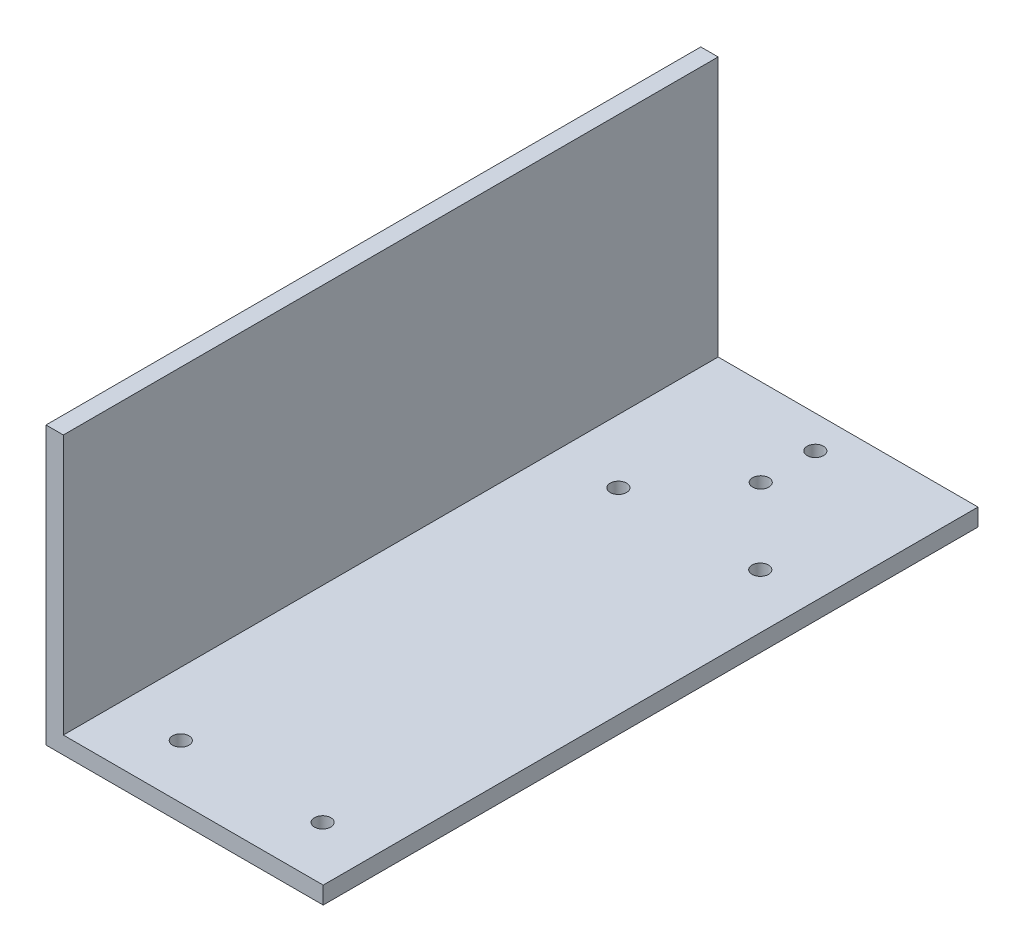
ISO-10303-21;
HEADER;
FILE_DESCRIPTION(('STEP AP214'),'2;1');
FILE_NAME('part.step','',(''),(''),'','','');
FILE_SCHEMA(('AUTOMOTIVE_DESIGN { 1 0 10303 214 1 1 1 1 }'));
ENDSEC;
DATA;
#1=APPLICATION_CONTEXT('core data for automotive mechanical design processes');
#2=APPLICATION_PROTOCOL_DEFINITION('international standard','automotive_design',2000,#1);
#3=PRODUCT_CONTEXT('',#1,'mechanical');
#4=PRODUCT('Part','Part','',(#3));
#5=PRODUCT_RELATED_PRODUCT_CATEGORY('part','',(#4));
#6=PRODUCT_DEFINITION_FORMATION('','',#4);
#7=PRODUCT_DEFINITION_CONTEXT('part definition',#1,'design');
#8=PRODUCT_DEFINITION('design','',#6,#7);
#9=PRODUCT_DEFINITION_SHAPE('','',#8);
#10=(LENGTH_UNIT() NAMED_UNIT(*) SI_UNIT(.MILLI.,.METRE.));
#11=(NAMED_UNIT(*) PLANE_ANGLE_UNIT() SI_UNIT($,.RADIAN.));
#12=(NAMED_UNIT(*) SI_UNIT($,.STERADIAN.) SOLID_ANGLE_UNIT());
#13=UNCERTAINTY_MEASURE_WITH_UNIT(LENGTH_MEASURE(1.E-05),#10,'distance_accuracy_value','');
#14=(GEOMETRIC_REPRESENTATION_CONTEXT(3) GLOBAL_UNCERTAINTY_ASSIGNED_CONTEXT((#13)) GLOBAL_UNIT_ASSIGNED_CONTEXT((#10,
#11,#12)) REPRESENTATION_CONTEXT('',''));
#15=CARTESIAN_POINT('',(0.,0.,0.));
#16=DIRECTION('',(0.,0.,1.));
#17=DIRECTION('',(1.,0.,0.));
#18=AXIS2_PLACEMENT_3D('',#15,#16,#17);
#19=CARTESIAN_POINT('',(0.,0.,120.));
#20=DIRECTION('',(1.,0.,0.));
#21=DIRECTION('',(0.,0.,-1.));
#22=AXIS2_PLACEMENT_3D('',#19,#20,#21);
#23=PLANE('',#22);
#24=DIRECTION('',(0.,-1.,0.));
#25=VECTOR('',#24,1.);
#26=CARTESIAN_POINT('',(0.,0.,0.));
#27=LINE('',#26,#25);
#28=CARTESIAN_POINT('',(0.,50.8,0.));
#29=VERTEX_POINT('',#28);
#30=CARTESIAN_POINT('',(0.,0.,0.));
#31=VERTEX_POINT('',#30);
#32=EDGE_CURVE('E132',#29,#31,#27,.T.);
#33=ORIENTED_EDGE('',*,*,#32,.T.);
#34=DIRECTION('',(0.,0.,-1.));
#35=VECTOR('',#34,1.);
#36=CARTESIAN_POINT('',(0.,0.,120.));
#37=LINE('',#36,#35);
#38=CARTESIAN_POINT('',(0.,0.,120.));
#39=VERTEX_POINT('',#38);
#40=EDGE_CURVE('E11',#39,#31,#37,.T.);
#41=ORIENTED_EDGE('',*,*,#40,.F.);
#42=DIRECTION('',(0.,-1.,0.));
#43=VECTOR('',#42,1.);
#44=CARTESIAN_POINT('',(0.,0.,120.));
#45=LINE('',#44,#43);
#46=CARTESIAN_POINT('',(0.,50.8,120.));
#47=VERTEX_POINT('',#46);
#48=EDGE_CURVE('E149',#47,#39,#45,.T.);
#49=ORIENTED_EDGE('',*,*,#48,.F.);
#50=DIRECTION('',(0.,0.,-1.));
#51=VECTOR('',#50,1.);
#52=CARTESIAN_POINT('',(0.,50.8,120.));
#53=LINE('',#52,#51);
#54=EDGE_CURVE('E128',#47,#29,#53,.T.);
#55=ORIENTED_EDGE('',*,*,#54,.T.);
#56=EDGE_LOOP('',(#33,#41,#49,#55));
#57=FACE_BOUND('',#56,.T.);
#58=ADVANCED_FACE('F43',(#57),#23,.F.);
#59=CARTESIAN_POINT('',(0.,0.,120.));
#60=DIRECTION('',(0.,1.,0.));
#61=DIRECTION('',(0.,0.,1.));
#62=AXIS2_PLACEMENT_3D('',#59,#60,#61);
#63=PLANE('',#62);
#64=CARTESIAN_POINT('',(26.985,0.,6.));
#65=DIRECTION('',(0.,1.,0.));
#66=DIRECTION('',(0.,0.,1.));
#67=AXIS2_PLACEMENT_3D('',#64,#65,#66);
#68=CIRCLE('',#67,1.5);
#69=CARTESIAN_POINT('',(26.985,0.,7.5));
#70=VERTEX_POINT('',#69);
#71=EDGE_CURVE('E376',#70,#70,#68,.T.);
#72=ORIENTED_EDGE('',*,*,#71,.T.);
#73=EDGE_LOOP('',(#72));
#74=FACE_BOUND('',#73,.T.);
#75=CARTESIAN_POINT('',(26.985,0.,16.));
#76=DIRECTION('',(0.,1.,0.));
#77=DIRECTION('',(0.,0.,1.));
#78=AXIS2_PLACEMENT_3D('',#75,#76,#77);
#79=CIRCLE('',#78,1.5);
#80=CARTESIAN_POINT('',(26.985,0.,17.5));
#81=VERTEX_POINT('',#80);
#82=EDGE_CURVE('E378',#81,#81,#79,.T.);
#83=ORIENTED_EDGE('',*,*,#82,.T.);
#84=EDGE_LOOP('',(#83));
#85=FACE_BOUND('',#84,.T.);
#86=CARTESIAN_POINT('',(40.8,0.,29.9));
#87=DIRECTION('',(0.,1.,0.));
#88=DIRECTION('',(0.,0.,1.));
#89=AXIS2_PLACEMENT_3D('',#86,#87,#88);
#90=CIRCLE('',#89,1.5);
#91=CARTESIAN_POINT('',(40.8,0.,31.4));
#92=VERTEX_POINT('',#91);
#93=EDGE_CURVE('E137',#92,#92,#90,.T.);
#94=ORIENTED_EDGE('',*,*,#93,.T.);
#95=EDGE_LOOP('',(#94));
#96=FACE_BOUND('',#95,.T.);
#97=CARTESIAN_POINT('',(14.8,0.,110.1));
#98=DIRECTION('',(0.,1.,0.));
#99=DIRECTION('',(0.,0.,1.));
#100=AXIS2_PLACEMENT_3D('',#97,#98,#99);
#101=CIRCLE('',#100,1.5);
#102=CARTESIAN_POINT('',(14.8,0.,111.6));
#103=VERTEX_POINT('',#102);
#104=EDGE_CURVE('E231',#103,#103,#101,.T.);
#105=ORIENTED_EDGE('',*,*,#104,.T.);
#106=EDGE_LOOP('',(#105));
#107=FACE_BOUND('',#106,.T.);
#108=CARTESIAN_POINT('',(40.8,0.,110.1));
#109=DIRECTION('',(0.,1.,0.));
#110=DIRECTION('',(0.,0.,1.));
#111=AXIS2_PLACEMENT_3D('',#108,#109,#110);
#112=CIRCLE('',#111,1.5);
#113=CARTESIAN_POINT('',(40.8,0.,111.6));
#114=VERTEX_POINT('',#113);
#115=EDGE_CURVE('E223',#114,#114,#112,.T.);
#116=ORIENTED_EDGE('',*,*,#115,.T.);
#117=EDGE_LOOP('',(#116));
#118=FACE_BOUND('',#117,.T.);
#119=CARTESIAN_POINT('',(14.8,0.,29.9));
#120=DIRECTION('',(0.,1.,0.));
#121=DIRECTION('',(0.,0.,1.));
#122=AXIS2_PLACEMENT_3D('',#119,#120,#121);
#123=CIRCLE('',#122,1.5);
#124=CARTESIAN_POINT('',(14.8,0.,31.4));
#125=VERTEX_POINT('',#124);
#126=EDGE_CURVE('E218',#125,#125,#123,.T.);
#127=ORIENTED_EDGE('',*,*,#126,.T.);
#128=EDGE_LOOP('',(#127));
#129=FACE_BOUND('',#128,.T.);
#130=DIRECTION('',(1.,0.,0.));
#131=VECTOR('',#130,1.);
#132=CARTESIAN_POINT('',(0.,0.,0.));
#133=LINE('',#132,#131);
#134=CARTESIAN_POINT('',(50.8,0.,0.));
#135=VERTEX_POINT('',#134);
#136=EDGE_CURVE('E136',#31,#135,#133,.T.);
#137=ORIENTED_EDGE('',*,*,#136,.T.);
#138=DIRECTION('',(0.,0.,-1.));
#139=VECTOR('',#138,1.);
#140=CARTESIAN_POINT('',(50.8,0.,120.));
#141=LINE('',#140,#139);
#142=CARTESIAN_POINT('',(50.8,0.,120.));
#143=VERTEX_POINT('',#142);
#144=EDGE_CURVE('E52',#143,#135,#141,.T.);
#145=ORIENTED_EDGE('',*,*,#144,.F.);
#146=DIRECTION('',(1.,0.,0.));
#147=VECTOR('',#146,1.);
#148=CARTESIAN_POINT('',(0.,0.,120.));
#149=LINE('',#148,#147);
#150=EDGE_CURVE('E97',#39,#143,#149,.T.);
#151=ORIENTED_EDGE('',*,*,#150,.F.);
#152=ORIENTED_EDGE('',*,*,#40,.T.);
#153=EDGE_LOOP('',(#137,#145,#151,#152));
#154=FACE_BOUND('',#153,.T.);
#155=ADVANCED_FACE('F177',(#74,#85,#96,#107,#118,#129,#154),#63,.F.);
#156=CARTESIAN_POINT('',(50.8,0.,120.));
#157=DIRECTION('',(-1.,0.,0.));
#158=DIRECTION('',(0.,-1.,0.));
#159=AXIS2_PLACEMENT_3D('',#156,#157,#158);
#160=PLANE('',#159);
#161=DIRECTION('',(0.,1.,0.));
#162=VECTOR('',#161,1.);
#163=CARTESIAN_POINT('',(50.8,0.,0.));
#164=LINE('',#163,#162);
#165=CARTESIAN_POINT('',(50.8,3.175,0.));
#166=VERTEX_POINT('',#165);
#167=EDGE_CURVE('E140',#135,#166,#164,.T.);
#168=ORIENTED_EDGE('',*,*,#167,.T.);
#169=DIRECTION('',(0.,0.,-1.));
#170=VECTOR('',#169,1.);
#171=CARTESIAN_POINT('',(50.8,3.175,120.));
#172=LINE('',#171,#170);
#173=CARTESIAN_POINT('',(50.8,3.175,120.));
#174=VERTEX_POINT('',#173);
#175=EDGE_CURVE('E121',#174,#166,#172,.T.);
#176=ORIENTED_EDGE('',*,*,#175,.F.);
#177=DIRECTION('',(0.,1.,0.));
#178=VECTOR('',#177,1.);
#179=CARTESIAN_POINT('',(50.8,0.,120.));
#180=LINE('',#179,#178);
#181=EDGE_CURVE('E110',#143,#174,#180,.T.);
#182=ORIENTED_EDGE('',*,*,#181,.F.);
#183=ORIENTED_EDGE('',*,*,#144,.T.);
#184=EDGE_LOOP('',(#168,#176,#182,#183));
#185=FACE_BOUND('',#184,.T.);
#186=ADVANCED_FACE('F159',(#185),#160,.F.);
#187=CARTESIAN_POINT('',(50.8,3.175,120.));
#188=DIRECTION('',(0.,-1.,0.));
#189=DIRECTION('',(1.,0.,0.));
#190=AXIS2_PLACEMENT_3D('',#187,#188,#189);
#191=PLANE('',#190);
#192=CARTESIAN_POINT('',(26.985,3.175,6.));
#193=DIRECTION('',(0.,1.,0.));
#194=DIRECTION('',(-1.,0.,0.));
#195=AXIS2_PLACEMENT_3D('',#192,#193,#194);
#196=CIRCLE('',#195,1.5);
#197=CARTESIAN_POINT('',(25.485,3.175,6.));
#198=VERTEX_POINT('',#197);
#199=EDGE_CURVE('E196',#198,#198,#196,.T.);
#200=ORIENTED_EDGE('',*,*,#199,.F.);
#201=EDGE_LOOP('',(#200));
#202=FACE_BOUND('',#201,.T.);
#203=CARTESIAN_POINT('',(26.985,3.175,16.));
#204=DIRECTION('',(0.,1.,0.));
#205=DIRECTION('',(-1.,0.,0.));
#206=AXIS2_PLACEMENT_3D('',#203,#204,#205);
#207=CIRCLE('',#206,1.5);
#208=CARTESIAN_POINT('',(25.485,3.175,16.));
#209=VERTEX_POINT('',#208);
#210=EDGE_CURVE('E200',#209,#209,#207,.T.);
#211=ORIENTED_EDGE('',*,*,#210,.F.);
#212=EDGE_LOOP('',(#211));
#213=FACE_BOUND('',#212,.T.);
#214=CARTESIAN_POINT('',(40.8,3.175,29.9));
#215=DIRECTION('',(0.,1.,0.));
#216=DIRECTION('',(-1.,0.,0.));
#217=AXIS2_PLACEMENT_3D('',#214,#215,#216);
#218=CIRCLE('',#217,1.5);
#219=CARTESIAN_POINT('',(39.3,3.175,29.9));
#220=VERTEX_POINT('',#219);
#221=EDGE_CURVE('E204',#220,#220,#218,.T.);
#222=ORIENTED_EDGE('',*,*,#221,.F.);
#223=EDGE_LOOP('',(#222));
#224=FACE_BOUND('',#223,.T.);
#225=CARTESIAN_POINT('',(14.8,3.175,110.1));
#226=DIRECTION('',(0.,1.,0.));
#227=DIRECTION('',(-1.,0.,0.));
#228=AXIS2_PLACEMENT_3D('',#225,#226,#227);
#229=CIRCLE('',#228,1.5);
#230=CARTESIAN_POINT('',(13.3,3.175,110.1));
#231=VERTEX_POINT('',#230);
#232=EDGE_CURVE('E208',#231,#231,#229,.T.);
#233=ORIENTED_EDGE('',*,*,#232,.F.);
#234=EDGE_LOOP('',(#233));
#235=FACE_BOUND('',#234,.T.);
#236=CARTESIAN_POINT('',(40.8,3.175,110.1));
#237=DIRECTION('',(0.,1.,0.));
#238=DIRECTION('',(-1.,0.,0.));
#239=AXIS2_PLACEMENT_3D('',#236,#237,#238);
#240=CIRCLE('',#239,1.5);
#241=CARTESIAN_POINT('',(39.3,3.175,110.1));
#242=VERTEX_POINT('',#241);
#243=EDGE_CURVE('E212',#242,#242,#240,.T.);
#244=ORIENTED_EDGE('',*,*,#243,.F.);
#245=EDGE_LOOP('',(#244));
#246=FACE_BOUND('',#245,.T.);
#247=CARTESIAN_POINT('',(14.8,3.175,29.9));
#248=DIRECTION('',(0.,1.,0.));
#249=DIRECTION('',(-1.,0.,0.));
#250=AXIS2_PLACEMENT_3D('',#247,#248,#249);
#251=CIRCLE('',#250,1.5);
#252=CARTESIAN_POINT('',(13.3,3.175,29.9));
#253=VERTEX_POINT('',#252);
#254=EDGE_CURVE('E215',#253,#253,#251,.T.);
#255=ORIENTED_EDGE('',*,*,#254,.F.);
#256=EDGE_LOOP('',(#255));
#257=FACE_BOUND('',#256,.T.);
#258=DIRECTION('',(-1.,0.,0.));
#259=VECTOR('',#258,1.);
#260=CARTESIAN_POINT('',(50.8,3.175,0.));
#261=LINE('',#260,#259);
#262=CARTESIAN_POINT('',(3.175,3.17499999999999,0.));
#263=VERTEX_POINT('',#262);
#264=EDGE_CURVE('E119',#166,#263,#261,.T.);
#265=ORIENTED_EDGE('',*,*,#264,.T.);
#266=DIRECTION('',(0.,0.,-1.));
#267=VECTOR('',#266,1.);
#268=CARTESIAN_POINT('',(3.175,3.17499999999999,120.));
#269=LINE('',#268,#267);
#270=CARTESIAN_POINT('',(3.175,3.17499999999999,120.));
#271=VERTEX_POINT('',#270);
#272=EDGE_CURVE('E116',#271,#263,#269,.T.);
#273=ORIENTED_EDGE('',*,*,#272,.F.);
#274=DIRECTION('',(-1.,0.,0.));
#275=VECTOR('',#274,1.);
#276=CARTESIAN_POINT('',(50.8,3.175,120.));
#277=LINE('',#276,#275);
#278=EDGE_CURVE('E104',#174,#271,#277,.T.);
#279=ORIENTED_EDGE('',*,*,#278,.F.);
#280=ORIENTED_EDGE('',*,*,#175,.T.);
#281=EDGE_LOOP('',(#265,#273,#279,#280));
#282=FACE_BOUND('',#281,.T.);
#283=ADVANCED_FACE('F117',(#202,#213,#224,#235,#246,#257,#282),#191,.F.);
#284=CARTESIAN_POINT('',(3.175,50.8,120.));
#285=DIRECTION('',(-1.,0.,0.));
#286=DIRECTION('',(0.,-1.,0.));
#287=AXIS2_PLACEMENT_3D('',#284,#285,#286);
#288=PLANE('',#287);
#289=DIRECTION('',(0.,1.,0.));
#290=VECTOR('',#289,1.);
#291=CARTESIAN_POINT('',(3.175,50.8,0.));
#292=LINE('',#291,#290);
#293=CARTESIAN_POINT('',(3.175,50.8,0.));
#294=VERTEX_POINT('',#293);
#295=EDGE_CURVE('E83',#263,#294,#292,.T.);
#296=ORIENTED_EDGE('',*,*,#295,.T.);
#297=DIRECTION('',(0.,0.,-1.));
#298=VECTOR('',#297,1.);
#299=CARTESIAN_POINT('',(3.175,50.8,120.));
#300=LINE('',#299,#298);
#301=CARTESIAN_POINT('',(3.175,50.8,120.));
#302=VERTEX_POINT('',#301);
#303=EDGE_CURVE('E122',#302,#294,#300,.T.);
#304=ORIENTED_EDGE('',*,*,#303,.F.);
#305=DIRECTION('',(0.,1.,0.));
#306=VECTOR('',#305,1.);
#307=CARTESIAN_POINT('',(3.175,50.8,120.));
#308=LINE('',#307,#306);
#309=EDGE_CURVE('E108',#271,#302,#308,.T.);
#310=ORIENTED_EDGE('',*,*,#309,.F.);
#311=ORIENTED_EDGE('',*,*,#272,.T.);
#312=EDGE_LOOP('',(#296,#304,#310,#311));
#313=FACE_BOUND('',#312,.T.);
#314=ADVANCED_FACE('F124',(#313),#288,.F.);
#315=CARTESIAN_POINT('',(0.,50.8,120.));
#316=DIRECTION('',(0.,-1.,0.));
#317=DIRECTION('',(1.,0.,0.));
#318=AXIS2_PLACEMENT_3D('',#315,#316,#317);
#319=PLANE('',#318);
#320=DIRECTION('',(-1.,0.,0.));
#321=VECTOR('',#320,1.);
#322=CARTESIAN_POINT('',(0.,50.8,0.));
#323=LINE('',#322,#321);
#324=EDGE_CURVE('E89',#294,#29,#323,.T.);
#325=ORIENTED_EDGE('',*,*,#324,.T.);
#326=ORIENTED_EDGE('',*,*,#54,.F.);
#327=DIRECTION('',(-1.,0.,0.));
#328=VECTOR('',#327,1.);
#329=CARTESIAN_POINT('',(0.,50.8,120.));
#330=LINE('',#329,#328);
#331=EDGE_CURVE('E60',#302,#47,#330,.T.);
#332=ORIENTED_EDGE('',*,*,#331,.F.);
#333=ORIENTED_EDGE('',*,*,#303,.T.);
#334=EDGE_LOOP('',(#325,#326,#332,#333));
#335=FACE_BOUND('',#334,.T.);
#336=ADVANCED_FACE('F166',(#335),#319,.F.);
#337=CARTESIAN_POINT('',(0.,0.,120.));
#338=DIRECTION('',(0.,0.,-1.));
#339=DIRECTION('',(-1.,0.,0.));
#340=AXIS2_PLACEMENT_3D('',#337,#338,#339);
#341=PLANE('',#340);
#342=ORIENTED_EDGE('',*,*,#48,.T.);
#343=ORIENTED_EDGE('',*,*,#150,.T.);
#344=ORIENTED_EDGE('',*,*,#181,.T.);
#345=ORIENTED_EDGE('',*,*,#278,.T.);
#346=ORIENTED_EDGE('',*,*,#309,.T.);
#347=ORIENTED_EDGE('',*,*,#331,.T.);
#348=EDGE_LOOP('',(#342,#343,#344,#345,#346,#347));
#349=FACE_BOUND('',#348,.T.);
#350=ADVANCED_FACE('F106',(#349),#341,.F.);
#351=CARTESIAN_POINT('',(0.,0.,0.));
#352=DIRECTION('',(0.,0.,-1.));
#353=DIRECTION('',(-1.,0.,0.));
#354=AXIS2_PLACEMENT_3D('',#351,#352,#353);
#355=PLANE('',#354);
#356=ORIENTED_EDGE('',*,*,#32,.F.);
#357=ORIENTED_EDGE('',*,*,#324,.F.);
#358=ORIENTED_EDGE('',*,*,#295,.F.);
#359=ORIENTED_EDGE('',*,*,#264,.F.);
#360=ORIENTED_EDGE('',*,*,#167,.F.);
#361=ORIENTED_EDGE('',*,*,#136,.F.);
#362=EDGE_LOOP('',(#356,#357,#358,#359,#360,#361));
#363=FACE_BOUND('',#362,.T.);
#364=ADVANCED_FACE('F162',(#363),#355,.T.);
#365=CARTESIAN_POINT('',(14.8,-96.825,29.9));
#366=DIRECTION('',(0.,1.,0.));
#367=DIRECTION('',(-1.,0.,0.));
#368=AXIS2_PLACEMENT_3D('',#365,#366,#367);
#369=CYLINDRICAL_SURFACE('',#368,1.5);
#370=ORIENTED_EDGE('',*,*,#254,.T.);
#371=EDGE_LOOP('',(#370));
#372=FACE_BOUND('',#371,.T.);
#373=ORIENTED_EDGE('',*,*,#126,.F.);
#374=EDGE_LOOP('',(#373));
#375=FACE_BOUND('',#374,.T.);
#376=ADVANCED_FACE('F264',(#372,#375),#369,.F.);
#377=CARTESIAN_POINT('',(40.8,-96.825,110.1));
#378=DIRECTION('',(0.,1.,0.));
#379=DIRECTION('',(-1.,0.,0.));
#380=AXIS2_PLACEMENT_3D('',#377,#378,#379);
#381=CYLINDRICAL_SURFACE('',#380,1.5);
#382=ORIENTED_EDGE('',*,*,#243,.T.);
#383=EDGE_LOOP('',(#382));
#384=FACE_BOUND('',#383,.T.);
#385=ORIENTED_EDGE('',*,*,#115,.F.);
#386=EDGE_LOOP('',(#385));
#387=FACE_BOUND('',#386,.T.);
#388=ADVANCED_FACE('F259',(#384,#387),#381,.F.);
#389=CARTESIAN_POINT('',(14.8,-96.825,110.1));
#390=DIRECTION('',(0.,1.,0.));
#391=DIRECTION('',(-1.,0.,0.));
#392=AXIS2_PLACEMENT_3D('',#389,#390,#391);
#393=CYLINDRICAL_SURFACE('',#392,1.5);
#394=ORIENTED_EDGE('',*,*,#232,.T.);
#395=EDGE_LOOP('',(#394));
#396=FACE_BOUND('',#395,.T.);
#397=ORIENTED_EDGE('',*,*,#104,.F.);
#398=EDGE_LOOP('',(#397));
#399=FACE_BOUND('',#398,.T.);
#400=ADVANCED_FACE('F249',(#396,#399),#393,.F.);
#401=CARTESIAN_POINT('',(40.8,-96.825,29.9));
#402=DIRECTION('',(0.,1.,0.));
#403=DIRECTION('',(-1.,0.,0.));
#404=AXIS2_PLACEMENT_3D('',#401,#402,#403);
#405=CYLINDRICAL_SURFACE('',#404,1.5);
#406=ORIENTED_EDGE('',*,*,#221,.T.);
#407=EDGE_LOOP('',(#406));
#408=FACE_BOUND('',#407,.T.);
#409=ORIENTED_EDGE('',*,*,#93,.F.);
#410=EDGE_LOOP('',(#409));
#411=FACE_BOUND('',#410,.T.);
#412=ADVANCED_FACE('F246',(#408,#411),#405,.F.);
#413=CARTESIAN_POINT('',(26.985,-96.825,16.));
#414=DIRECTION('',(0.,1.,0.));
#415=DIRECTION('',(-1.,0.,0.));
#416=AXIS2_PLACEMENT_3D('',#413,#414,#415);
#417=CYLINDRICAL_SURFACE('',#416,1.5);
#418=ORIENTED_EDGE('',*,*,#210,.T.);
#419=EDGE_LOOP('',(#418));
#420=FACE_BOUND('',#419,.T.);
#421=ORIENTED_EDGE('',*,*,#82,.F.);
#422=EDGE_LOOP('',(#421));
#423=FACE_BOUND('',#422,.T.);
#424=ADVANCED_FACE('F248',(#420,#423),#417,.F.);
#425=CARTESIAN_POINT('',(26.985,-96.825,6.));
#426=DIRECTION('',(0.,1.,0.));
#427=DIRECTION('',(-1.,0.,0.));
#428=AXIS2_PLACEMENT_3D('',#425,#426,#427);
#429=CYLINDRICAL_SURFACE('',#428,1.5);
#430=ORIENTED_EDGE('',*,*,#199,.T.);
#431=EDGE_LOOP('',(#430));
#432=FACE_BOUND('',#431,.T.);
#433=ORIENTED_EDGE('',*,*,#71,.F.);
#434=EDGE_LOOP('',(#433));
#435=FACE_BOUND('',#434,.T.);
#436=ADVANCED_FACE('F256',(#432,#435),#429,.F.);
#437=CLOSED_SHELL('',(#58,#155,#186,#283,#314,#336,#350,#364,#376,#388,#400,#412,#424,#436));
#438=MANIFOLD_SOLID_BREP('B2',#437);
#439=ADVANCED_BREP_SHAPE_REPRESENTATION('',(#18,#438),#14);
#440=SHAPE_DEFINITION_REPRESENTATION(#9,#439);
ENDSEC;
END-ISO-10303-21;
